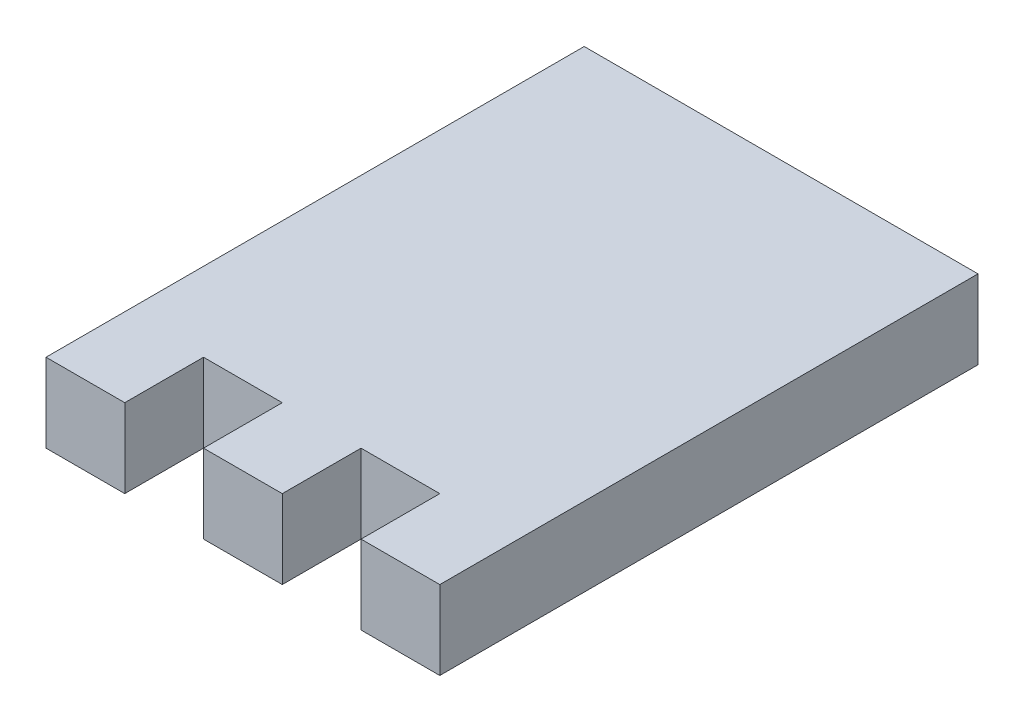
ISO-10303-21;
HEADER;
FILE_DESCRIPTION(('STEP AP214'),'2;1');
FILE_NAME('part.step','',(''),(''),'','','');
FILE_SCHEMA(('AUTOMOTIVE_DESIGN { 1 0 10303 214 1 1 1 1 }'));
ENDSEC;
DATA;
#1=APPLICATION_CONTEXT('core data for automotive mechanical design processes');
#2=APPLICATION_PROTOCOL_DEFINITION('international standard','automotive_design',2000,#1);
#3=PRODUCT_CONTEXT('',#1,'mechanical');
#4=PRODUCT('Part','Part','',(#3));
#5=PRODUCT_RELATED_PRODUCT_CATEGORY('part','',(#4));
#6=PRODUCT_DEFINITION_FORMATION('','',#4);
#7=PRODUCT_DEFINITION_CONTEXT('part definition',#1,'design');
#8=PRODUCT_DEFINITION('design','',#6,#7);
#9=PRODUCT_DEFINITION_SHAPE('','',#8);
#10=(LENGTH_UNIT() NAMED_UNIT(*) SI_UNIT(.MILLI.,.METRE.));
#11=(NAMED_UNIT(*) PLANE_ANGLE_UNIT() SI_UNIT($,.RADIAN.));
#12=(NAMED_UNIT(*) SI_UNIT($,.STERADIAN.) SOLID_ANGLE_UNIT());
#13=UNCERTAINTY_MEASURE_WITH_UNIT(LENGTH_MEASURE(1.E-05),#10,'distance_accuracy_value','');
#14=(GEOMETRIC_REPRESENTATION_CONTEXT(3) GLOBAL_UNCERTAINTY_ASSIGNED_CONTEXT((#13)) GLOBAL_UNIT_ASSIGNED_CONTEXT((#10,
#11,#12)) REPRESENTATION_CONTEXT('',''));
#15=CARTESIAN_POINT('',(0.,0.,0.));
#16=DIRECTION('',(0.,0.,1.));
#17=DIRECTION('',(1.,0.,0.));
#18=AXIS2_PLACEMENT_3D('',#15,#16,#17);
#19=CARTESIAN_POINT('',(-7.48098232078596,3.,7.62751062567733));
#20=DIRECTION('',(0.,0.,-1.));
#21=DIRECTION('',(-1.,0.,0.));
#22=AXIS2_PLACEMENT_3D('',#19,#20,#21);
#23=PLANE('',#22);
#24=DIRECTION('',(1.,0.,0.));
#25=VECTOR('',#24,1.);
#26=CARTESIAN_POINT('',(-7.48098232078596,0.,7.62751062567733));
#27=LINE('',#26,#25);
#28=CARTESIAN_POINT('',(-7.48098232078596,0.,7.62751062567733));
#29=VERTEX_POINT('',#28);
#30=CARTESIAN_POINT('',(-4.48098232078596,0.,7.62751062567733));
#31=VERTEX_POINT('',#30);
#32=EDGE_CURVE('E166',#29,#31,#27,.T.);
#33=ORIENTED_EDGE('',*,*,#32,.T.);
#34=DIRECTION('',(0.,-1.,0.));
#35=VECTOR('',#34,1.);
#36=CARTESIAN_POINT('',(-4.48098232078596,3.,7.62751062567733));
#37=LINE('',#36,#35);
#38=CARTESIAN_POINT('',(-4.48098232078596,3.,7.62751062567733));
#39=VERTEX_POINT('',#38);
#40=EDGE_CURVE('E11',#39,#31,#37,.T.);
#41=ORIENTED_EDGE('',*,*,#40,.F.);
#42=DIRECTION('',(1.,0.,0.));
#43=VECTOR('',#42,1.);
#44=CARTESIAN_POINT('',(-7.48098232078596,3.,7.62751062567733));
#45=LINE('',#44,#43);
#46=CARTESIAN_POINT('',(-7.48098232078596,3.,7.62751062567733));
#47=VERTEX_POINT('',#46);
#48=EDGE_CURVE('E207',#47,#39,#45,.T.);
#49=ORIENTED_EDGE('',*,*,#48,.F.);
#50=DIRECTION('',(0.,-1.,0.));
#51=VECTOR('',#50,1.);
#52=CARTESIAN_POINT('',(-7.48098232078596,3.,7.62751062567733));
#53=LINE('',#52,#51);
#54=EDGE_CURVE('E56',#47,#29,#53,.T.);
#55=ORIENTED_EDGE('',*,*,#54,.T.);
#56=EDGE_LOOP('',(#33,#41,#49,#55));
#57=FACE_BOUND('',#56,.T.);
#58=ADVANCED_FACE('F39',(#57),#23,.F.);
#59=CARTESIAN_POINT('',(-4.48098232078596,3.,7.62751062567733));
#60=DIRECTION('',(-1.,0.,0.));
#61=DIRECTION('',(0.,0.,1.));
#62=AXIS2_PLACEMENT_3D('',#59,#60,#61);
#63=PLANE('',#62);
#64=DIRECTION('',(0.,0.,-1.));
#65=VECTOR('',#64,1.);
#66=CARTESIAN_POINT('',(-4.48098232078596,0.,7.62751062567733));
#67=LINE('',#66,#65);
#68=CARTESIAN_POINT('',(-4.48098232078596,0.,4.62751062567733));
#69=VERTEX_POINT('',#68);
#70=EDGE_CURVE('E169',#31,#69,#67,.T.);
#71=ORIENTED_EDGE('',*,*,#70,.T.);
#72=DIRECTION('',(0.,-1.,0.));
#73=VECTOR('',#72,1.);
#74=CARTESIAN_POINT('',(-4.48098232078596,3.,4.62751062567733));
#75=LINE('',#74,#73);
#76=CARTESIAN_POINT('',(-4.48098232078596,3.,4.62751062567733));
#77=VERTEX_POINT('',#76);
#78=EDGE_CURVE('E48',#77,#69,#75,.T.);
#79=ORIENTED_EDGE('',*,*,#78,.F.);
#80=DIRECTION('',(0.,0.,-1.));
#81=VECTOR('',#80,1.);
#82=CARTESIAN_POINT('',(-4.48098232078596,3.,7.62751062567733));
#83=LINE('',#82,#81);
#84=EDGE_CURVE('E106',#39,#77,#83,.T.);
#85=ORIENTED_EDGE('',*,*,#84,.F.);
#86=ORIENTED_EDGE('',*,*,#40,.T.);
#87=EDGE_LOOP('',(#71,#79,#85,#86));
#88=FACE_BOUND('',#87,.T.);
#89=ADVANCED_FACE('F292',(#88),#63,.F.);
#90=CARTESIAN_POINT('',(-4.48098232078596,3.,4.62751062567733));
#91=DIRECTION('',(0.,0.,-1.));
#92=DIRECTION('',(-1.,0.,0.));
#93=AXIS2_PLACEMENT_3D('',#90,#91,#92);
#94=PLANE('',#93);
#95=DIRECTION('',(1.,0.,0.));
#96=VECTOR('',#95,1.);
#97=CARTESIAN_POINT('',(-4.48098232078596,0.,4.62751062567733));
#98=LINE('',#97,#96);
#99=CARTESIAN_POINT('',(-1.48098232078596,0.,4.62751062567733));
#100=VERTEX_POINT('',#99);
#101=EDGE_CURVE('E172',#69,#100,#98,.T.);
#102=ORIENTED_EDGE('',*,*,#101,.T.);
#103=DIRECTION('',(0.,-1.,0.));
#104=VECTOR('',#103,1.);
#105=CARTESIAN_POINT('',(-1.48098232078596,3.,4.62751062567733));
#106=LINE('',#105,#104);
#107=CARTESIAN_POINT('',(-1.48098232078596,3.,4.62751062567733));
#108=VERTEX_POINT('',#107);
#109=EDGE_CURVE('E230',#108,#100,#106,.T.);
#110=ORIENTED_EDGE('',*,*,#109,.F.);
#111=DIRECTION('',(1.,0.,0.));
#112=VECTOR('',#111,1.);
#113=CARTESIAN_POINT('',(-4.48098232078596,3.,4.62751062567733));
#114=LINE('',#113,#112);
#115=EDGE_CURVE('E239',#77,#108,#114,.T.);
#116=ORIENTED_EDGE('',*,*,#115,.F.);
#117=ORIENTED_EDGE('',*,*,#78,.T.);
#118=EDGE_LOOP('',(#102,#110,#116,#117));
#119=FACE_BOUND('',#118,.T.);
#120=ADVANCED_FACE('F237',(#119),#94,.F.);
#121=CARTESIAN_POINT('',(-1.48098232078596,3.,7.62751062567733));
#122=DIRECTION('',(-1.,0.,0.));
#123=DIRECTION('',(0.,0.,1.));
#124=AXIS2_PLACEMENT_3D('',#121,#122,#123);
#125=PLANE('',#124);
#126=DIRECTION('',(0.,0.,-1.));
#127=VECTOR('',#126,1.);
#128=CARTESIAN_POINT('',(-1.48098232078596,0.,7.62751062567733));
#129=LINE('',#128,#127);
#130=CARTESIAN_POINT('',(-1.48098232078596,0.,7.62751062567733));
#131=VERTEX_POINT('',#130);
#132=EDGE_CURVE('E176',#131,#100,#129,.T.);
#133=ORIENTED_EDGE('',*,*,#132,.F.);
#134=DIRECTION('',(0.,-1.,0.));
#135=VECTOR('',#134,1.);
#136=CARTESIAN_POINT('',(-1.48098232078596,3.,7.62751062567733));
#137=LINE('',#136,#135);
#138=CARTESIAN_POINT('',(-1.48098232078596,3.,7.62751062567733));
#139=VERTEX_POINT('',#138);
#140=EDGE_CURVE('E227',#139,#131,#137,.T.);
#141=ORIENTED_EDGE('',*,*,#140,.F.);
#142=DIRECTION('',(0.,0.,-1.));
#143=VECTOR('',#142,1.);
#144=CARTESIAN_POINT('',(-1.48098232078596,3.,7.62751062567733));
#145=LINE('',#144,#143);
#146=EDGE_CURVE('E250',#139,#108,#145,.T.);
#147=ORIENTED_EDGE('',*,*,#146,.T.);
#148=ORIENTED_EDGE('',*,*,#109,.T.);
#149=EDGE_LOOP('',(#133,#141,#147,#148));
#150=FACE_BOUND('',#149,.T.);
#151=ADVANCED_FACE('F246',(#150),#125,.T.);
#152=CARTESIAN_POINT('',(-1.48098232078596,3.,7.62751062567733));
#153=DIRECTION('',(0.,0.,-1.));
#154=DIRECTION('',(-1.,0.,0.));
#155=AXIS2_PLACEMENT_3D('',#152,#153,#154);
#156=PLANE('',#155);
#157=DIRECTION('',(1.,0.,0.));
#158=VECTOR('',#157,1.);
#159=CARTESIAN_POINT('',(-1.48098232078596,0.,7.62751062567733));
#160=LINE('',#159,#158);
#161=CARTESIAN_POINT('',(1.51901767921405,0.,7.62751062567733));
#162=VERTEX_POINT('',#161);
#163=EDGE_CURVE('E180',#131,#162,#160,.T.);
#164=ORIENTED_EDGE('',*,*,#163,.T.);
#165=DIRECTION('',(0.,-1.,0.));
#166=VECTOR('',#165,1.);
#167=CARTESIAN_POINT('',(1.51901767921405,3.,7.62751062567733));
#168=LINE('',#167,#166);
#169=CARTESIAN_POINT('',(1.51901767921405,3.,7.62751062567733));
#170=VERTEX_POINT('',#169);
#171=EDGE_CURVE('E223',#170,#162,#168,.T.);
#172=ORIENTED_EDGE('',*,*,#171,.F.);
#173=DIRECTION('',(1.,0.,0.));
#174=VECTOR('',#173,1.);
#175=CARTESIAN_POINT('',(-1.48098232078596,3.,7.62751062567733));
#176=LINE('',#175,#174);
#177=EDGE_CURVE('E252',#139,#170,#176,.T.);
#178=ORIENTED_EDGE('',*,*,#177,.F.);
#179=ORIENTED_EDGE('',*,*,#140,.T.);
#180=EDGE_LOOP('',(#164,#172,#178,#179));
#181=FACE_BOUND('',#180,.T.);
#182=ADVANCED_FACE('F358',(#181),#156,.F.);
#183=CARTESIAN_POINT('',(1.51901767921405,3.,7.62751062567733));
#184=DIRECTION('',(-1.,0.,0.));
#185=DIRECTION('',(0.,0.,1.));
#186=AXIS2_PLACEMENT_3D('',#183,#184,#185);
#187=PLANE('',#186);
#188=DIRECTION('',(0.,0.,-1.));
#189=VECTOR('',#188,1.);
#190=CARTESIAN_POINT('',(1.51901767921405,0.,7.62751062567733));
#191=LINE('',#190,#189);
#192=CARTESIAN_POINT('',(1.51901767921405,0.,4.62751062567733));
#193=VERTEX_POINT('',#192);
#194=EDGE_CURVE('E183',#162,#193,#191,.T.);
#195=ORIENTED_EDGE('',*,*,#194,.T.);
#196=DIRECTION('',(0.,-1.,0.));
#197=VECTOR('',#196,1.);
#198=CARTESIAN_POINT('',(1.51901767921405,3.,4.62751062567733));
#199=LINE('',#198,#197);
#200=CARTESIAN_POINT('',(1.51901767921405,3.,4.62751062567733));
#201=VERTEX_POINT('',#200);
#202=EDGE_CURVE('E220',#201,#193,#199,.T.);
#203=ORIENTED_EDGE('',*,*,#202,.F.);
#204=DIRECTION('',(0.,0.,-1.));
#205=VECTOR('',#204,1.);
#206=CARTESIAN_POINT('',(1.51901767921405,3.,7.62751062567733));
#207=LINE('',#206,#205);
#208=EDGE_CURVE('E256',#170,#201,#207,.T.);
#209=ORIENTED_EDGE('',*,*,#208,.F.);
#210=ORIENTED_EDGE('',*,*,#171,.T.);
#211=EDGE_LOOP('',(#195,#203,#209,#210));
#212=FACE_BOUND('',#211,.T.);
#213=ADVANCED_FACE('F349',(#212),#187,.F.);
#214=CARTESIAN_POINT('',(4.51901767921405,3.,4.62751062567733));
#215=DIRECTION('',(0.,0.,1.));
#216=DIRECTION('',(1.,0.,0.));
#217=AXIS2_PLACEMENT_3D('',#214,#215,#216);
#218=PLANE('',#217);
#219=DIRECTION('',(-1.,0.,0.));
#220=VECTOR('',#219,1.);
#221=CARTESIAN_POINT('',(4.51901767921405,0.,4.62751062567733));
#222=LINE('',#221,#220);
#223=CARTESIAN_POINT('',(4.51901767921405,0.,4.62751062567733));
#224=VERTEX_POINT('',#223);
#225=EDGE_CURVE('E187',#224,#193,#222,.T.);
#226=ORIENTED_EDGE('',*,*,#225,.F.);
#227=DIRECTION('',(0.,-1.,0.));
#228=VECTOR('',#227,1.);
#229=CARTESIAN_POINT('',(4.51901767921405,3.,4.62751062567733));
#230=LINE('',#229,#228);
#231=CARTESIAN_POINT('',(4.51901767921405,3.,4.62751062567733));
#232=VERTEX_POINT('',#231);
#233=EDGE_CURVE('E217',#232,#224,#230,.T.);
#234=ORIENTED_EDGE('',*,*,#233,.F.);
#235=DIRECTION('',(-1.,0.,0.));
#236=VECTOR('',#235,1.);
#237=CARTESIAN_POINT('',(4.51901767921405,3.,4.62751062567733));
#238=LINE('',#237,#236);
#239=EDGE_CURVE('E263',#232,#201,#238,.T.);
#240=ORIENTED_EDGE('',*,*,#239,.T.);
#241=ORIENTED_EDGE('',*,*,#202,.T.);
#242=EDGE_LOOP('',(#226,#234,#240,#241));
#243=FACE_BOUND('',#242,.T.);
#244=ADVANCED_FACE('F279',(#243),#218,.T.);
#245=CARTESIAN_POINT('',(4.51901767921405,3.,7.62751062567733));
#246=DIRECTION('',(-1.,0.,0.));
#247=DIRECTION('',(0.,0.,1.));
#248=AXIS2_PLACEMENT_3D('',#245,#246,#247);
#249=PLANE('',#248);
#250=DIRECTION('',(0.,0.,-1.));
#251=VECTOR('',#250,1.);
#252=CARTESIAN_POINT('',(4.51901767921405,0.,7.62751062567733));
#253=LINE('',#252,#251);
#254=CARTESIAN_POINT('',(4.51901767921405,0.,7.62751062567733));
#255=VERTEX_POINT('',#254);
#256=EDGE_CURVE('E191',#255,#224,#253,.T.);
#257=ORIENTED_EDGE('',*,*,#256,.F.);
#258=DIRECTION('',(0.,-1.,0.));
#259=VECTOR('',#258,1.);
#260=CARTESIAN_POINT('',(4.51901767921405,3.,7.62751062567733));
#261=LINE('',#260,#259);
#262=CARTESIAN_POINT('',(4.51901767921405,3.,7.62751062567733));
#263=VERTEX_POINT('',#262);
#264=EDGE_CURVE('E214',#263,#255,#261,.T.);
#265=ORIENTED_EDGE('',*,*,#264,.F.);
#266=DIRECTION('',(0.,0.,-1.));
#267=VECTOR('',#266,1.);
#268=CARTESIAN_POINT('',(4.51901767921405,3.,7.62751062567733));
#269=LINE('',#268,#267);
#270=EDGE_CURVE('E267',#263,#232,#269,.T.);
#271=ORIENTED_EDGE('',*,*,#270,.T.);
#272=ORIENTED_EDGE('',*,*,#233,.T.);
#273=EDGE_LOOP('',(#257,#265,#271,#272));
#274=FACE_BOUND('',#273,.T.);
#275=ADVANCED_FACE('F273',(#274),#249,.T.);
#276=CARTESIAN_POINT('',(4.51901767921405,3.,7.62751062567733));
#277=DIRECTION('',(0.,0.,-1.));
#278=DIRECTION('',(-1.,0.,0.));
#279=AXIS2_PLACEMENT_3D('',#276,#277,#278);
#280=PLANE('',#279);
#281=DIRECTION('',(1.,0.,0.));
#282=VECTOR('',#281,1.);
#283=CARTESIAN_POINT('',(4.51901767921405,0.,7.62751062567733));
#284=LINE('',#283,#282);
#285=CARTESIAN_POINT('',(7.51901767921405,0.,7.62751062567733));
#286=VERTEX_POINT('',#285);
#287=EDGE_CURVE('E195',#255,#286,#284,.T.);
#288=ORIENTED_EDGE('',*,*,#287,.T.);
#289=DIRECTION('',(0.,-1.,0.));
#290=VECTOR('',#289,1.);
#291=CARTESIAN_POINT('',(7.51901767921405,3.,7.62751062567733));
#292=LINE('',#291,#290);
#293=CARTESIAN_POINT('',(7.51901767921405,3.,7.62751062567733));
#294=VERTEX_POINT('',#293);
#295=EDGE_CURVE('E156',#294,#286,#292,.T.);
#296=ORIENTED_EDGE('',*,*,#295,.F.);
#297=DIRECTION('',(1.,0.,0.));
#298=VECTOR('',#297,1.);
#299=CARTESIAN_POINT('',(4.51901767921405,3.,7.62751062567733));
#300=LINE('',#299,#298);
#301=EDGE_CURVE('E142',#263,#294,#300,.T.);
#302=ORIENTED_EDGE('',*,*,#301,.F.);
#303=ORIENTED_EDGE('',*,*,#264,.T.);
#304=EDGE_LOOP('',(#288,#296,#302,#303));
#305=FACE_BOUND('',#304,.T.);
#306=ADVANCED_FACE('F282',(#305),#280,.F.);
#307=CARTESIAN_POINT('',(7.51901767921405,3.,7.62751062567733));
#308=DIRECTION('',(-1.,0.,0.));
#309=DIRECTION('',(0.,0.,1.));
#310=AXIS2_PLACEMENT_3D('',#307,#308,#309);
#311=PLANE('',#310);
#312=DIRECTION('',(0.,0.,-1.));
#313=VECTOR('',#312,1.);
#314=CARTESIAN_POINT('',(7.51901767921405,0.,7.62751062567733));
#315=LINE('',#314,#313);
#316=CARTESIAN_POINT('',(7.51901767921404,0.,-12.8724893743227));
#317=VERTEX_POINT('',#316);
#318=EDGE_CURVE('E152',#286,#317,#315,.T.);
#319=ORIENTED_EDGE('',*,*,#318,.T.);
#320=DIRECTION('',(0.,-1.,0.));
#321=VECTOR('',#320,1.);
#322=CARTESIAN_POINT('',(7.51901767921404,3.,-12.8724893743227));
#323=LINE('',#322,#321);
#324=CARTESIAN_POINT('',(7.51901767921404,3.,-12.8724893743227));
#325=VERTEX_POINT('',#324);
#326=EDGE_CURVE('E149',#325,#317,#323,.T.);
#327=ORIENTED_EDGE('',*,*,#326,.F.);
#328=DIRECTION('',(0.,0.,-1.));
#329=VECTOR('',#328,1.);
#330=CARTESIAN_POINT('',(7.51901767921405,3.,7.62751062567733));
#331=LINE('',#330,#329);
#332=EDGE_CURVE('E134',#294,#325,#331,.T.);
#333=ORIENTED_EDGE('',*,*,#332,.F.);
#334=ORIENTED_EDGE('',*,*,#295,.T.);
#335=EDGE_LOOP('',(#319,#327,#333,#334));
#336=FACE_BOUND('',#335,.T.);
#337=ADVANCED_FACE('F150',(#336),#311,.F.);
#338=CARTESIAN_POINT('',(-7.48098232078596,3.,-12.8724893743227));
#339=DIRECTION('',(0.,0.,-1.));
#340=DIRECTION('',(-1.,0.,0.));
#341=AXIS2_PLACEMENT_3D('',#338,#339,#340);
#342=PLANE('',#341);
#343=DIRECTION('',(1.,0.,0.));
#344=VECTOR('',#343,1.);
#345=CARTESIAN_POINT('',(-7.48098232078596,0.,-12.8724893743227));
#346=LINE('',#345,#344);
#347=CARTESIAN_POINT('',(-7.48098232078596,0.,-12.8724893743227));
#348=VERTEX_POINT('',#347);
#349=EDGE_CURVE('E200',#348,#317,#346,.T.);
#350=ORIENTED_EDGE('',*,*,#349,.F.);
#351=DIRECTION('',(0.,-1.,0.));
#352=VECTOR('',#351,1.);
#353=CARTESIAN_POINT('',(-7.48098232078596,3.,-12.8724893743227));
#354=LINE('',#353,#352);
#355=CARTESIAN_POINT('',(-7.48098232078596,3.,-12.8724893743227));
#356=VERTEX_POINT('',#355);
#357=EDGE_CURVE('E94',#356,#348,#354,.T.);
#358=ORIENTED_EDGE('',*,*,#357,.F.);
#359=DIRECTION('',(1.,0.,0.));
#360=VECTOR('',#359,1.);
#361=CARTESIAN_POINT('',(-7.48098232078596,3.,-12.8724893743227));
#362=LINE('',#361,#360);
#363=EDGE_CURVE('E139',#356,#325,#362,.T.);
#364=ORIENTED_EDGE('',*,*,#363,.T.);
#365=ORIENTED_EDGE('',*,*,#326,.T.);
#366=EDGE_LOOP('',(#350,#358,#364,#365));
#367=FACE_BOUND('',#366,.T.);
#368=ADVANCED_FACE('F158',(#367),#342,.T.);
#369=CARTESIAN_POINT('',(-7.48098232078596,3.,7.62751062567733));
#370=DIRECTION('',(-1.,0.,0.));
#371=DIRECTION('',(0.,0.,1.));
#372=AXIS2_PLACEMENT_3D('',#369,#370,#371);
#373=PLANE('',#372);
#374=DIRECTION('',(0.,0.,-1.));
#375=VECTOR('',#374,1.);
#376=CARTESIAN_POINT('',(-7.48098232078596,0.,7.62751062567733));
#377=LINE('',#376,#375);
#378=EDGE_CURVE('E203',#29,#348,#377,.T.);
#379=ORIENTED_EDGE('',*,*,#378,.F.);
#380=ORIENTED_EDGE('',*,*,#54,.F.);
#381=DIRECTION('',(0.,0.,-1.));
#382=VECTOR('',#381,1.);
#383=CARTESIAN_POINT('',(-7.48098232078596,3.,7.62751062567733));
#384=LINE('',#383,#382);
#385=EDGE_CURVE('E160',#47,#356,#384,.T.);
#386=ORIENTED_EDGE('',*,*,#385,.T.);
#387=ORIENTED_EDGE('',*,*,#357,.T.);
#388=EDGE_LOOP('',(#379,#380,#386,#387));
#389=FACE_BOUND('',#388,.T.);
#390=ADVANCED_FACE('F297',(#389),#373,.T.);
#391=CARTESIAN_POINT('',(0.,3.,0.));
#392=DIRECTION('',(0.,1.,0.));
#393=DIRECTION('',(0.,0.,1.));
#394=AXIS2_PLACEMENT_3D('',#391,#392,#393);
#395=PLANE('',#394);
#396=ORIENTED_EDGE('',*,*,#48,.T.);
#397=ORIENTED_EDGE('',*,*,#84,.T.);
#398=ORIENTED_EDGE('',*,*,#115,.T.);
#399=ORIENTED_EDGE('',*,*,#146,.F.);
#400=ORIENTED_EDGE('',*,*,#177,.T.);
#401=ORIENTED_EDGE('',*,*,#208,.T.);
#402=ORIENTED_EDGE('',*,*,#239,.F.);
#403=ORIENTED_EDGE('',*,*,#270,.F.);
#404=ORIENTED_EDGE('',*,*,#301,.T.);
#405=ORIENTED_EDGE('',*,*,#332,.T.);
#406=ORIENTED_EDGE('',*,*,#363,.F.);
#407=ORIENTED_EDGE('',*,*,#385,.F.);
#408=EDGE_LOOP('',(#396,#397,#398,#399,#400,#401,#402,#403,#404,#405,#406,#407));
#409=FACE_BOUND('',#408,.T.);
#410=ADVANCED_FACE('F136',(#409),#395,.T.);
#411=CARTESIAN_POINT('',(0.,0.,0.));
#412=DIRECTION('',(0.,1.,0.));
#413=DIRECTION('',(0.,0.,1.));
#414=AXIS2_PLACEMENT_3D('',#411,#412,#413);
#415=PLANE('',#414);
#416=ORIENTED_EDGE('',*,*,#32,.F.);
#417=ORIENTED_EDGE('',*,*,#378,.T.);
#418=ORIENTED_EDGE('',*,*,#349,.T.);
#419=ORIENTED_EDGE('',*,*,#318,.F.);
#420=ORIENTED_EDGE('',*,*,#287,.F.);
#421=ORIENTED_EDGE('',*,*,#256,.T.);
#422=ORIENTED_EDGE('',*,*,#225,.T.);
#423=ORIENTED_EDGE('',*,*,#194,.F.);
#424=ORIENTED_EDGE('',*,*,#163,.F.);
#425=ORIENTED_EDGE('',*,*,#132,.T.);
#426=ORIENTED_EDGE('',*,*,#101,.F.);
#427=ORIENTED_EDGE('',*,*,#70,.F.);
#428=EDGE_LOOP('',(#416,#417,#418,#419,#420,#421,#422,#423,#424,#425,#426,#427));
#429=FACE_BOUND('',#428,.T.);
#430=ADVANCED_FACE('F241',(#429),#415,.F.);
#431=CLOSED_SHELL('',(#58,#89,#120,#151,#182,#213,#244,#275,#306,#337,#368,#390,#410,#430));
#432=MANIFOLD_SOLID_BREP('B2',#431);
#433=ADVANCED_BREP_SHAPE_REPRESENTATION('',(#18,#432),#14);
#434=SHAPE_DEFINITION_REPRESENTATION(#9,#433);
ENDSEC;
END-ISO-10303-21;
